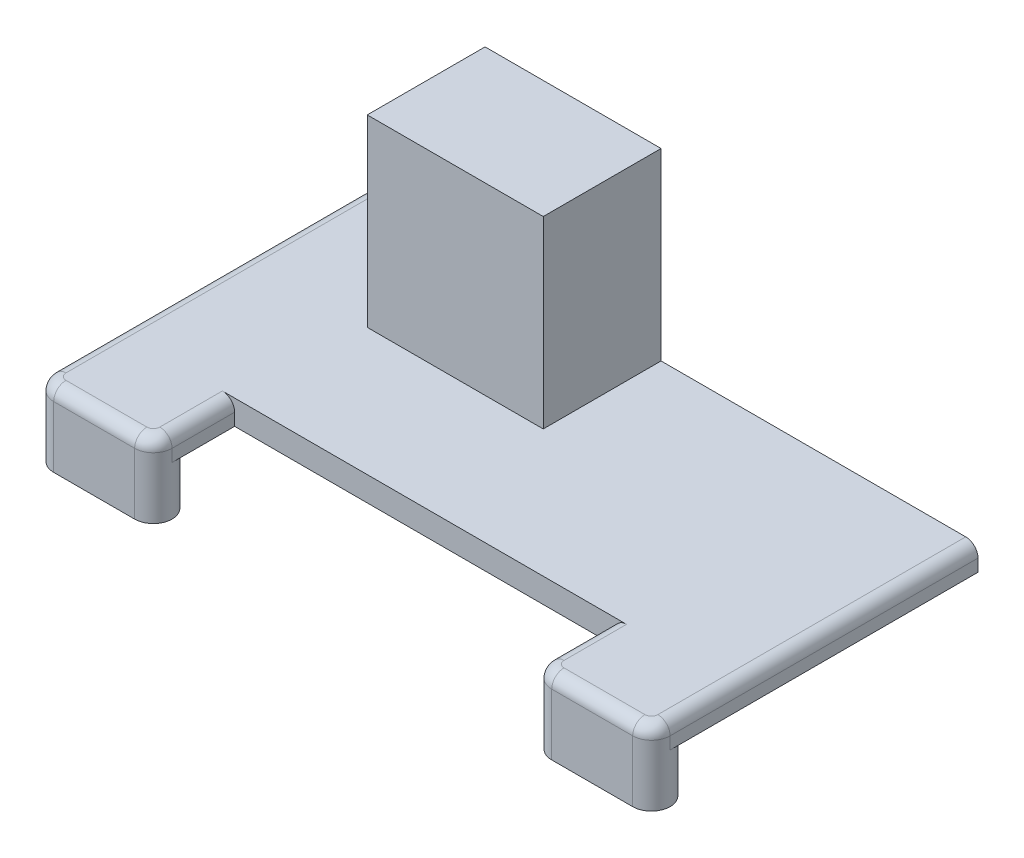
ISO-10303-21;
HEADER;
FILE_DESCRIPTION(('STEP AP214'),'2;1');
FILE_NAME('part.step','',(''),(''),'','','');
FILE_SCHEMA(('AUTOMOTIVE_DESIGN { 1 0 10303 214 1 1 1 1 }'));
ENDSEC;
DATA;
#1=APPLICATION_CONTEXT('core data for automotive mechanical design processes');
#2=APPLICATION_PROTOCOL_DEFINITION('international standard','automotive_design',2000,#1);
#3=PRODUCT_CONTEXT('',#1,'mechanical');
#4=PRODUCT('Part','Part','',(#3));
#5=PRODUCT_RELATED_PRODUCT_CATEGORY('part','',(#4));
#6=PRODUCT_DEFINITION_FORMATION('','',#4);
#7=PRODUCT_DEFINITION_CONTEXT('part definition',#1,'design');
#8=PRODUCT_DEFINITION('design','',#6,#7);
#9=PRODUCT_DEFINITION_SHAPE('','',#8);
#10=(LENGTH_UNIT() NAMED_UNIT(*) SI_UNIT(.MILLI.,.METRE.));
#11=(NAMED_UNIT(*) PLANE_ANGLE_UNIT() SI_UNIT($,.RADIAN.));
#12=(NAMED_UNIT(*) SI_UNIT($,.STERADIAN.) SOLID_ANGLE_UNIT());
#13=UNCERTAINTY_MEASURE_WITH_UNIT(LENGTH_MEASURE(1.E-05),#10,'distance_accuracy_value','');
#14=(GEOMETRIC_REPRESENTATION_CONTEXT(3) GLOBAL_UNCERTAINTY_ASSIGNED_CONTEXT((#13)) GLOBAL_UNIT_ASSIGNED_CONTEXT((#10,
#11,#12)) REPRESENTATION_CONTEXT('',''));
#15=CARTESIAN_POINT('',(0.,0.,0.));
#16=DIRECTION('',(0.,0.,1.));
#17=DIRECTION('',(1.,0.,0.));
#18=AXIS2_PLACEMENT_3D('',#15,#16,#17);
#19=CARTESIAN_POINT('',(0.,6.,0.));
#20=DIRECTION('',(0.,1.,0.));
#21=DIRECTION('',(0.,0.,1.));
#22=AXIS2_PLACEMENT_3D('',#19,#20,#21);
#23=PLANE('',#22);
#24=DIRECTION('',(1.,0.,0.));
#25=VECTOR('',#24,1.);
#26=CARTESIAN_POINT('',(-15.0591382947298,6.,-24.512734040284));
#27=LINE('',#26,#25);
#28=CARTESIAN_POINT('',(-15.0591382947298,6.,-24.512734040284));
#29=VERTEX_POINT('',#28);
#30=CARTESIAN_POINT('',(-0.711455352506912,6.,-24.512734040284));
#31=VERTEX_POINT('',#30);
#32=EDGE_CURVE('E577',#29,#31,#27,.T.);
#33=ORIENTED_EDGE('',*,*,#32,.F.);
#34=DIRECTION('',(0.,0.,1.));
#35=VECTOR('',#34,1.);
#36=CARTESIAN_POINT('',(-15.0591382947298,6.,-34.1172784368942));
#37=LINE('',#36,#35);
#38=CARTESIAN_POINT('',(-15.0591382947298,6.,-34.1172784368942));
#39=VERTEX_POINT('',#38);
#40=EDGE_CURVE('E248',#39,#29,#37,.T.);
#41=ORIENTED_EDGE('',*,*,#40,.F.);
#42=DIRECTION('',(1.,0.,0.));
#43=VECTOR('',#42,1.);
#44=CARTESIAN_POINT('',(0.,6.,-34.1172784368942));
#45=LINE('',#44,#43);
#46=CARTESIAN_POINT('',(-24.125,6.,-34.1172784368942));
#47=VERTEX_POINT('',#46);
#48=EDGE_CURVE('E302',#47,#39,#45,.T.);
#49=ORIENTED_EDGE('',*,*,#48,.F.);
#50=DIRECTION('',(0.,0.,-1.));
#51=VECTOR('',#50,1.);
#52=CARTESIAN_POINT('',(-24.125,6.,0.));
#53=LINE('',#52,#51);
#54=CARTESIAN_POINT('',(-24.125,6.,-9.01727843689422));
#55=VERTEX_POINT('',#54);
#56=EDGE_CURVE('E438',#47,#55,#53,.F.);
#57=ORIENTED_EDGE('',*,*,#56,.T.);
#58=CARTESIAN_POINT('',(-23.6,6.,-9.01727843689422));
#59=DIRECTION('',(0.,1.,0.));
#60=DIRECTION('',(0.,0.,1.));
#61=AXIS2_PLACEMENT_3D('',#58,#59,#60);
#62=CIRCLE('',#61,0.525);
#63=CARTESIAN_POINT('',(-23.6,6.,-8.49227843689422));
#64=VERTEX_POINT('',#63);
#65=EDGE_CURVE('E435',#55,#64,#62,.T.);
#66=ORIENTED_EDGE('',*,*,#65,.T.);
#67=DIRECTION('',(1.,0.,0.));
#68=VECTOR('',#67,1.);
#69=CARTESIAN_POINT('',(-17.,6.,-8.49227843689422));
#70=LINE('',#69,#68);
#71=CARTESIAN_POINT('',(-17.,6.,-8.49227843689422));
#72=VERTEX_POINT('',#71);
#73=EDGE_CURVE('E425',#64,#72,#70,.T.);
#74=ORIENTED_EDGE('',*,*,#73,.T.);
#75=CARTESIAN_POINT('',(-17.,6.,-9.01727843689422));
#76=DIRECTION('',(0.,1.,0.));
#77=DIRECTION('',(0.,0.,1.));
#78=AXIS2_PLACEMENT_3D('',#75,#76,#77);
#79=CIRCLE('',#78,0.525000000000001);
#80=CARTESIAN_POINT('',(-16.475,6.,-9.01727843689422));
#81=VERTEX_POINT('',#80);
#82=EDGE_CURVE('E428',#72,#81,#79,.T.);
#83=ORIENTED_EDGE('',*,*,#82,.T.);
#84=DIRECTION('',(0.,0.,-1.));
#85=VECTOR('',#84,1.);
#86=CARTESIAN_POINT('',(-16.475,6.,-14.1172784368942));
#87=LINE('',#86,#85);
#88=CARTESIAN_POINT('',(-16.475,6.,-14.1172784368942));
#89=VERTEX_POINT('',#88);
#90=EDGE_CURVE('E431',#81,#89,#87,.T.);
#91=ORIENTED_EDGE('',*,*,#90,.T.);
#92=DIRECTION('',(1.,0.,0.));
#93=VECTOR('',#92,1.);
#94=CARTESIAN_POINT('',(0.,6.,-14.1172784368942));
#95=LINE('',#94,#93);
#96=CARTESIAN_POINT('',(16.475,6.,-14.1172784368942));
#97=VERTEX_POINT('',#96);
#98=EDGE_CURVE('E297',#89,#97,#95,.T.);
#99=ORIENTED_EDGE('',*,*,#98,.T.);
#100=DIRECTION('',(0.,0.,-1.));
#101=VECTOR('',#100,1.);
#102=CARTESIAN_POINT('',(16.475,6.,0.));
#103=LINE('',#102,#101);
#104=CARTESIAN_POINT('',(16.475,6.,-9.01727843689422));
#105=VERTEX_POINT('',#104);
#106=EDGE_CURVE('E422',#97,#105,#103,.F.);
#107=ORIENTED_EDGE('',*,*,#106,.T.);
#108=CARTESIAN_POINT('',(17.,6.,-9.01727843689422));
#109=DIRECTION('',(0.,1.,0.));
#110=DIRECTION('',(0.,0.,1.));
#111=AXIS2_PLACEMENT_3D('',#108,#109,#110);
#112=CIRCLE('',#111,0.525000000000001);
#113=CARTESIAN_POINT('',(17.,6.,-8.49227843689422));
#114=VERTEX_POINT('',#113);
#115=EDGE_CURVE('E419',#105,#114,#112,.T.);
#116=ORIENTED_EDGE('',*,*,#115,.T.);
#117=DIRECTION('',(1.,0.,0.));
#118=VECTOR('',#117,1.);
#119=CARTESIAN_POINT('',(23.6,6.,-8.49227843689422));
#120=LINE('',#119,#118);
#121=CARTESIAN_POINT('',(23.6,6.,-8.49227843689422));
#122=VERTEX_POINT('',#121);
#123=EDGE_CURVE('E409',#114,#122,#120,.T.);
#124=ORIENTED_EDGE('',*,*,#123,.T.);
#125=CARTESIAN_POINT('',(23.6,6.,-9.01727843689422));
#126=DIRECTION('',(0.,1.,0.));
#127=DIRECTION('',(0.,0.,1.));
#128=AXIS2_PLACEMENT_3D('',#125,#126,#127);
#129=CIRCLE('',#128,0.525);
#130=CARTESIAN_POINT('',(24.125,6.,-9.01727843689422));
#131=VERTEX_POINT('',#130);
#132=EDGE_CURVE('E412',#122,#131,#129,.T.);
#133=ORIENTED_EDGE('',*,*,#132,.T.);
#134=DIRECTION('',(0.,0.,-1.));
#135=VECTOR('',#134,1.);
#136=CARTESIAN_POINT('',(24.125,6.,-34.1172784368942));
#137=LINE('',#136,#135);
#138=CARTESIAN_POINT('',(24.125,6.,-34.1172784368942));
#139=VERTEX_POINT('',#138);
#140=EDGE_CURVE('E415',#131,#139,#137,.T.);
#141=ORIENTED_EDGE('',*,*,#140,.T.);
#142=CARTESIAN_POINT('',(-0.711455352506912,6.,-34.1172784368942));
#143=VERTEX_POINT('',#142);
#144=EDGE_CURVE('E300',#143,#139,#45,.T.);
#145=ORIENTED_EDGE('',*,*,#144,.F.);
#146=DIRECTION('',(0.,0.,-1.));
#147=VECTOR('',#146,1.);
#148=CARTESIAN_POINT('',(-0.711455352506912,6.,-34.1172784368942));
#149=LINE('',#148,#147);
#150=EDGE_CURVE('E244',#31,#143,#149,.T.);
#151=ORIENTED_EDGE('',*,*,#150,.F.);
#152=EDGE_LOOP('',(#33,#41,#49,#57,#66,#74,#83,#91,#99,#107,#116,#124,#133,#141,#145,#151));
#153=FACE_BOUND('',#152,.T.);
#154=ADVANCED_FACE('F47',(#153),#23,.T.);
#155=CARTESIAN_POINT('',(0.,4.,0.));
#156=DIRECTION('',(0.,1.,0.));
#157=DIRECTION('',(0.,0.,1.));
#158=AXIS2_PLACEMENT_3D('',#155,#156,#157);
#159=PLANE('',#158);
#160=CARTESIAN_POINT('',(-23.6,4.,-9.01727843689422));
#161=DIRECTION('',(0.,1.,0.));
#162=DIRECTION('',(0.,0.,1.));
#163=AXIS2_PLACEMENT_3D('',#160,#161,#162);
#164=CIRCLE('',#163,1.525);
#165=CARTESIAN_POINT('',(-23.6,4.,-10.5422784368942));
#166=VERTEX_POINT('',#165);
#167=CARTESIAN_POINT('',(-25.125,4.,-9.01727843689422));
#168=VERTEX_POINT('',#167);
#169=EDGE_CURVE('E275',#166,#168,#164,.T.);
#170=ORIENTED_EDGE('',*,*,#169,.T.);
#171=DIRECTION('',(0.,0.,-1.));
#172=VECTOR('',#171,1.);
#173=CARTESIAN_POINT('',(-25.125,4.,0.));
#174=LINE('',#173,#172);
#175=CARTESIAN_POINT('',(-25.125,4.,-34.1172784368942));
#176=VERTEX_POINT('',#175);
#177=EDGE_CURVE('E286',#168,#176,#174,.T.);
#178=ORIENTED_EDGE('',*,*,#177,.T.);
#179=DIRECTION('',(1.,0.,0.));
#180=VECTOR('',#179,1.);
#181=CARTESIAN_POINT('',(0.,4.,-34.1172784368942));
#182=LINE('',#181,#180);
#183=CARTESIAN_POINT('',(25.125,4.,-34.1172784368942));
#184=VERTEX_POINT('',#183);
#185=EDGE_CURVE('E301',#176,#184,#182,.T.);
#186=ORIENTED_EDGE('',*,*,#185,.T.);
#187=DIRECTION('',(0.,0.,-1.));
#188=VECTOR('',#187,1.);
#189=CARTESIAN_POINT('',(25.125,4.,0.));
#190=LINE('',#189,#188);
#191=CARTESIAN_POINT('',(25.125,4.,-9.01727843689422));
#192=VERTEX_POINT('',#191);
#193=EDGE_CURVE('E322',#192,#184,#190,.T.);
#194=ORIENTED_EDGE('',*,*,#193,.F.);
#195=CARTESIAN_POINT('',(23.6,4.,-9.01727843689422));
#196=DIRECTION('',(0.,1.,0.));
#197=DIRECTION('',(0.,0.,-1.));
#198=AXIS2_PLACEMENT_3D('',#195,#196,#197);
#199=CIRCLE('',#198,1.525);
#200=CARTESIAN_POINT('',(23.6,4.,-10.5422784368942));
#201=VERTEX_POINT('',#200);
#202=EDGE_CURVE('E359',#192,#201,#199,.T.);
#203=ORIENTED_EDGE('',*,*,#202,.T.);
#204=DIRECTION('',(-1.,0.,0.));
#205=VECTOR('',#204,1.);
#206=CARTESIAN_POINT('',(23.6,4.,-10.5422784368942));
#207=LINE('',#206,#205);
#208=CARTESIAN_POINT('',(17.,4.,-10.5422784368942));
#209=VERTEX_POINT('',#208);
#210=EDGE_CURVE('E363',#201,#209,#207,.T.);
#211=ORIENTED_EDGE('',*,*,#210,.T.);
#212=CARTESIAN_POINT('',(17.,4.,-9.01727843689422));
#213=DIRECTION('',(0.,1.,0.));
#214=DIRECTION('',(0.,0.,-1.));
#215=AXIS2_PLACEMENT_3D('',#212,#213,#214);
#216=CIRCLE('',#215,1.525);
#217=CARTESIAN_POINT('',(15.475,4.,-9.01727843689422));
#218=VERTEX_POINT('',#217);
#219=EDGE_CURVE('E368',#209,#218,#216,.T.);
#220=ORIENTED_EDGE('',*,*,#219,.T.);
#221=DIRECTION('',(0.,0.,-1.));
#222=VECTOR('',#221,1.);
#223=CARTESIAN_POINT('',(15.475,4.,0.));
#224=LINE('',#223,#222);
#225=CARTESIAN_POINT('',(15.475,4.,-14.1172784368942));
#226=VERTEX_POINT('',#225);
#227=EDGE_CURVE('E318',#218,#226,#224,.T.);
#228=ORIENTED_EDGE('',*,*,#227,.T.);
#229=DIRECTION('',(1.,0.,0.));
#230=VECTOR('',#229,1.);
#231=CARTESIAN_POINT('',(0.,4.,-14.1172784368942));
#232=LINE('',#231,#230);
#233=CARTESIAN_POINT('',(-15.475,4.,-14.1172784368942));
#234=VERTEX_POINT('',#233);
#235=EDGE_CURVE('E314',#234,#226,#232,.T.);
#236=ORIENTED_EDGE('',*,*,#235,.F.);
#237=DIRECTION('',(0.,0.,-1.));
#238=VECTOR('',#237,1.);
#239=CARTESIAN_POINT('',(-15.475,4.,0.));
#240=LINE('',#239,#238);
#241=CARTESIAN_POINT('',(-15.475,4.,-9.01727843689422));
#242=VERTEX_POINT('',#241);
#243=EDGE_CURVE('E310',#242,#234,#240,.T.);
#244=ORIENTED_EDGE('',*,*,#243,.F.);
#245=CARTESIAN_POINT('',(-17.,4.,-9.01727843689422));
#246=DIRECTION('',(0.,1.,0.));
#247=DIRECTION('',(0.,0.,1.));
#248=AXIS2_PLACEMENT_3D('',#245,#246,#247);
#249=CIRCLE('',#248,1.525);
#250=CARTESIAN_POINT('',(-17.,4.,-10.5422784368942));
#251=VERTEX_POINT('',#250);
#252=EDGE_CURVE('E290',#242,#251,#249,.T.);
#253=ORIENTED_EDGE('',*,*,#252,.T.);
#254=DIRECTION('',(-1.,0.,0.));
#255=VECTOR('',#254,1.);
#256=CARTESIAN_POINT('',(-23.6,4.,-10.5422784368942));
#257=LINE('',#256,#255);
#258=EDGE_CURVE('E270',#251,#166,#257,.T.);
#259=ORIENTED_EDGE('',*,*,#258,.T.);
#260=EDGE_LOOP('',(#170,#178,#186,#194,#203,#211,#220,#228,#236,#244,#253,#259));
#261=FACE_BOUND('',#260,.T.);
#262=ADVANCED_FACE('F526',(#261),#159,.F.);
#263=CARTESIAN_POINT('',(23.6,4.,-9.01727843689422));
#264=DIRECTION('',(0.,-1.,0.));
#265=DIRECTION('',(0.,0.,-1.));
#266=AXIS2_PLACEMENT_3D('',#263,#264,#265);
#267=CYLINDRICAL_SURFACE('',#266,1.525);
#268=DIRECTION('',(0.,-1.,0.));
#269=VECTOR('',#268,1.);
#270=CARTESIAN_POINT('',(25.125,6.,-9.01727843689422));
#271=LINE('',#270,#269);
#272=CARTESIAN_POINT('',(25.125,5.,-9.01727843689422));
#273=VERTEX_POINT('',#272);
#274=EDGE_CURVE('E334',#273,#192,#271,.T.);
#275=ORIENTED_EDGE('',*,*,#274,.F.);
#276=CARTESIAN_POINT('',(23.6,5.,-9.01727843689422));
#277=DIRECTION('',(0.,1.,0.));
#278=DIRECTION('',(0.,0.,1.));
#279=AXIS2_PLACEMENT_3D('',#276,#277,#278);
#280=CIRCLE('',#279,1.525);
#281=CARTESIAN_POINT('',(23.6,5.,-7.49227843689422));
#282=VERTEX_POINT('',#281);
#283=EDGE_CURVE('E73',#273,#282,#280,.F.);
#284=ORIENTED_EDGE('',*,*,#283,.T.);
#285=DIRECTION('',(0.,-1.,0.));
#286=VECTOR('',#285,1.);
#287=CARTESIAN_POINT('',(23.6,4.,-7.49227843689422));
#288=LINE('',#287,#286);
#289=CARTESIAN_POINT('',(23.6,0.,-7.49227843689422));
#290=VERTEX_POINT('',#289);
#291=EDGE_CURVE('E372',#282,#290,#288,.T.);
#292=ORIENTED_EDGE('',*,*,#291,.T.);
#293=CARTESIAN_POINT('',(23.6,0.,-9.01727843689422));
#294=DIRECTION('',(0.,1.,0.));
#295=DIRECTION('',(0.,0.,-1.));
#296=AXIS2_PLACEMENT_3D('',#293,#294,#295);
#297=CIRCLE('',#296,1.525);
#298=CARTESIAN_POINT('',(23.6,0.,-10.5422784368942));
#299=VERTEX_POINT('',#298);
#300=EDGE_CURVE('E358',#290,#299,#297,.T.);
#301=ORIENTED_EDGE('',*,*,#300,.T.);
#302=DIRECTION('',(0.,-1.,0.));
#303=VECTOR('',#302,1.);
#304=CARTESIAN_POINT('',(23.6,4.,-10.5422784368942));
#305=LINE('',#304,#303);
#306=EDGE_CURVE('E395',#201,#299,#305,.T.);
#307=ORIENTED_EDGE('',*,*,#306,.F.);
#308=ORIENTED_EDGE('',*,*,#202,.F.);
#309=EDGE_LOOP('',(#275,#284,#292,#301,#307,#308));
#310=FACE_BOUND('',#309,.T.);
#311=ADVANCED_FACE('F536',(#310),#267,.T.);
#312=CARTESIAN_POINT('',(23.6,4.,-10.5422784368942));
#313=DIRECTION('',(0.,0.,1.));
#314=DIRECTION('',(1.,0.,0.));
#315=AXIS2_PLACEMENT_3D('',#312,#313,#314);
#316=PLANE('',#315);
#317=DIRECTION('',(-1.,0.,0.));
#318=VECTOR('',#317,1.);
#319=CARTESIAN_POINT('',(23.6,0.,-10.5422784368942));
#320=LINE('',#319,#318);
#321=CARTESIAN_POINT('',(17.,0.,-10.5422784368942));
#322=VERTEX_POINT('',#321);
#323=EDGE_CURVE('E376',#299,#322,#320,.T.);
#324=ORIENTED_EDGE('',*,*,#323,.T.);
#325=DIRECTION('',(0.,-1.,0.));
#326=VECTOR('',#325,1.);
#327=CARTESIAN_POINT('',(17.,4.,-10.5422784368942));
#328=LINE('',#327,#326);
#329=EDGE_CURVE('E391',#209,#322,#328,.T.);
#330=ORIENTED_EDGE('',*,*,#329,.F.);
#331=ORIENTED_EDGE('',*,*,#210,.F.);
#332=ORIENTED_EDGE('',*,*,#306,.T.);
#333=EDGE_LOOP('',(#324,#330,#331,#332));
#334=FACE_BOUND('',#333,.T.);
#335=ADVANCED_FACE('F637',(#334),#316,.F.);
#336=CARTESIAN_POINT('',(17.,4.,-9.01727843689422));
#337=DIRECTION('',(0.,-1.,0.));
#338=DIRECTION('',(0.,0.,-1.));
#339=AXIS2_PLACEMENT_3D('',#336,#337,#338);
#340=CYLINDRICAL_SURFACE('',#339,1.525);
#341=DIRECTION('',(0.,-1.,0.));
#342=VECTOR('',#341,1.);
#343=CARTESIAN_POINT('',(17.,4.,-7.49227843689422));
#344=LINE('',#343,#342);
#345=CARTESIAN_POINT('',(17.,5.,-7.49227843689422));
#346=VERTEX_POINT('',#345);
#347=CARTESIAN_POINT('',(17.,0.,-7.49227843689422));
#348=VERTEX_POINT('',#347);
#349=EDGE_CURVE('E388',#346,#348,#344,.T.);
#350=ORIENTED_EDGE('',*,*,#349,.F.);
#351=CARTESIAN_POINT('',(17.,5.,-9.01727843689422));
#352=DIRECTION('',(0.,1.,0.));
#353=DIRECTION('',(0.,0.,1.));
#354=AXIS2_PLACEMENT_3D('',#351,#352,#353);
#355=CIRCLE('',#354,1.525);
#356=CARTESIAN_POINT('',(15.475,5.,-9.01727843689422));
#357=VERTEX_POINT('',#356);
#358=EDGE_CURVE('E454',#346,#357,#355,.F.);
#359=ORIENTED_EDGE('',*,*,#358,.T.);
#360=DIRECTION('',(0.,-1.,0.));
#361=VECTOR('',#360,1.);
#362=CARTESIAN_POINT('',(15.475,6.,-9.01727843689422));
#363=LINE('',#362,#361);
#364=EDGE_CURVE('E337',#357,#218,#363,.T.);
#365=ORIENTED_EDGE('',*,*,#364,.T.);
#366=ORIENTED_EDGE('',*,*,#219,.F.);
#367=ORIENTED_EDGE('',*,*,#329,.T.);
#368=CARTESIAN_POINT('',(17.,0.,-9.01727843689422));
#369=DIRECTION('',(0.,1.,0.));
#370=DIRECTION('',(0.,0.,-1.));
#371=AXIS2_PLACEMENT_3D('',#368,#369,#370);
#372=CIRCLE('',#371,1.525);
#373=EDGE_CURVE('E379',#322,#348,#372,.T.);
#374=ORIENTED_EDGE('',*,*,#373,.T.);
#375=EDGE_LOOP('',(#350,#359,#365,#366,#367,#374));
#376=FACE_BOUND('',#375,.T.);
#377=ADVANCED_FACE('F518',(#376),#340,.T.);
#378=CARTESIAN_POINT('',(23.6,4.,-7.49227843689422));
#379=DIRECTION('',(0.,0.,-1.));
#380=DIRECTION('',(-1.,0.,0.));
#381=AXIS2_PLACEMENT_3D('',#378,#379,#380);
#382=PLANE('',#381);
#383=ORIENTED_EDGE('',*,*,#291,.F.);
#384=DIRECTION('',(1.,0.,0.));
#385=VECTOR('',#384,1.);
#386=CARTESIAN_POINT('',(17.,5.,-7.49227843689422));
#387=LINE('',#386,#385);
#388=EDGE_CURVE('E465',#282,#346,#387,.F.);
#389=ORIENTED_EDGE('',*,*,#388,.T.);
#390=ORIENTED_EDGE('',*,*,#349,.T.);
#391=DIRECTION('',(1.,0.,0.));
#392=VECTOR('',#391,1.);
#393=CARTESIAN_POINT('',(23.6,0.,-7.49227843689422));
#394=LINE('',#393,#392);
#395=EDGE_CURVE('E364',#348,#290,#394,.T.);
#396=ORIENTED_EDGE('',*,*,#395,.T.);
#397=EDGE_LOOP('',(#383,#389,#390,#396));
#398=FACE_BOUND('',#397,.T.);
#399=ADVANCED_FACE('F535',(#398),#382,.F.);
#400=CARTESIAN_POINT('',(23.6,0.,-9.01727843689422));
#401=DIRECTION('',(0.,-1.,0.));
#402=DIRECTION('',(0.,0.,-1.));
#403=AXIS2_PLACEMENT_3D('',#400,#401,#402);
#404=PLANE('',#403);
#405=ORIENTED_EDGE('',*,*,#300,.F.);
#406=ORIENTED_EDGE('',*,*,#395,.F.);
#407=ORIENTED_EDGE('',*,*,#373,.F.);
#408=ORIENTED_EDGE('',*,*,#323,.F.);
#409=EDGE_LOOP('',(#405,#406,#407,#408));
#410=FACE_BOUND('',#409,.T.);
#411=ADVANCED_FACE('F533',(#410),#404,.T.);
#412=CARTESIAN_POINT('',(-25.125,6.,0.));
#413=DIRECTION('',(-1.,0.,0.));
#414=DIRECTION('',(0.,0.,1.));
#415=AXIS2_PLACEMENT_3D('',#412,#413,#414);
#416=PLANE('',#415);
#417=DIRECTION('',(0.,-1.,0.));
#418=VECTOR('',#417,1.);
#419=CARTESIAN_POINT('',(-25.125,6.,-9.01727843689422));
#420=LINE('',#419,#418);
#421=CARTESIAN_POINT('',(-25.125,5.,-9.01727843689422));
#422=VERTEX_POINT('',#421);
#423=EDGE_CURVE('E355',#422,#168,#420,.T.);
#424=ORIENTED_EDGE('',*,*,#423,.F.);
#425=DIRECTION('',(0.,0.,-1.));
#426=VECTOR('',#425,1.);
#427=CARTESIAN_POINT('',(-25.125,5.,0.));
#428=LINE('',#427,#426);
#429=CARTESIAN_POINT('',(-25.125,5.,-34.1172784368942));
#430=VERTEX_POINT('',#429);
#431=EDGE_CURVE('E399',#422,#430,#428,.T.);
#432=ORIENTED_EDGE('',*,*,#431,.T.);
#433=DIRECTION('',(0.,-1.,0.));
#434=VECTOR('',#433,1.);
#435=CARTESIAN_POINT('',(-25.125,6.,-34.1172784368942));
#436=LINE('',#435,#434);
#437=EDGE_CURVE('E306',#430,#176,#436,.T.);
#438=ORIENTED_EDGE('',*,*,#437,.T.);
#439=ORIENTED_EDGE('',*,*,#177,.F.);
#440=EDGE_LOOP('',(#424,#432,#438,#439));
#441=FACE_BOUND('',#440,.T.);
#442=ADVANCED_FACE('F551',(#441),#416,.T.);
#443=CARTESIAN_POINT('',(-23.6,6.,-9.01727843689422));
#444=DIRECTION('',(0.,-1.,0.));
#445=DIRECTION('',(0.,0.,-1.));
#446=AXIS2_PLACEMENT_3D('',#443,#444,#445);
#447=CYLINDRICAL_SURFACE('',#446,1.525);
#448=DIRECTION('',(0.,-1.,0.));
#449=VECTOR('',#448,1.);
#450=CARTESIAN_POINT('',(-23.6,6.,-7.49227843689422));
#451=LINE('',#450,#449);
#452=CARTESIAN_POINT('',(-23.6,5.,-7.49227843689422));
#453=VERTEX_POINT('',#452);
#454=CARTESIAN_POINT('',(-23.6,0.,-7.49227843689422));
#455=VERTEX_POINT('',#454);
#456=EDGE_CURVE('E352',#453,#455,#451,.T.);
#457=ORIENTED_EDGE('',*,*,#456,.F.);
#458=CARTESIAN_POINT('',(-23.6,5.,-9.01727843689422));
#459=DIRECTION('',(0.,1.,0.));
#460=DIRECTION('',(0.,0.,1.));
#461=AXIS2_PLACEMENT_3D('',#458,#459,#460);
#462=CIRCLE('',#461,1.525);
#463=EDGE_CURVE('E441',#453,#422,#462,.F.);
#464=ORIENTED_EDGE('',*,*,#463,.T.);
#465=ORIENTED_EDGE('',*,*,#423,.T.);
#466=ORIENTED_EDGE('',*,*,#169,.F.);
#467=DIRECTION('',(0.,-1.,0.));
#468=VECTOR('',#467,1.);
#469=CARTESIAN_POINT('',(-23.6,4.,-10.5422784368942));
#470=LINE('',#469,#468);
#471=CARTESIAN_POINT('',(-23.6,0.,-10.5422784368942));
#472=VERTEX_POINT('',#471);
#473=EDGE_CURVE('E265',#166,#472,#470,.T.);
#474=ORIENTED_EDGE('',*,*,#473,.T.);
#475=CARTESIAN_POINT('',(-23.6,0.,-9.01727843689422));
#476=DIRECTION('',(0.,1.,0.));
#477=DIRECTION('',(0.,0.,1.));
#478=AXIS2_PLACEMENT_3D('',#475,#476,#477);
#479=CIRCLE('',#478,1.525);
#480=EDGE_CURVE('E282',#472,#455,#479,.T.);
#481=ORIENTED_EDGE('',*,*,#480,.T.);
#482=EDGE_LOOP('',(#457,#464,#465,#466,#474,#481));
#483=FACE_BOUND('',#482,.T.);
#484=ADVANCED_FACE('F557',(#483),#447,.T.);
#485=CARTESIAN_POINT('',(0.,6.,-7.49227843689422));
#486=DIRECTION('',(0.,0.,-1.));
#487=DIRECTION('',(-1.,0.,0.));
#488=AXIS2_PLACEMENT_3D('',#485,#486,#487);
#489=PLANE('',#488);
#490=DIRECTION('',(0.,-1.,0.));
#491=VECTOR('',#490,1.);
#492=CARTESIAN_POINT('',(-17.,6.,-7.49227843689422));
#493=LINE('',#492,#491);
#494=CARTESIAN_POINT('',(-17.,5.,-7.49227843689422));
#495=VERTEX_POINT('',#494);
#496=CARTESIAN_POINT('',(-17.,0.,-7.49227843689422));
#497=VERTEX_POINT('',#496);
#498=EDGE_CURVE('E349',#495,#497,#493,.T.);
#499=ORIENTED_EDGE('',*,*,#498,.F.);
#500=DIRECTION('',(1.,0.,0.));
#501=VECTOR('',#500,1.);
#502=CARTESIAN_POINT('',(-23.6,5.,-7.49227843689422));
#503=LINE('',#502,#501);
#504=EDGE_CURVE('E462',#495,#453,#503,.F.);
#505=ORIENTED_EDGE('',*,*,#504,.T.);
#506=ORIENTED_EDGE('',*,*,#456,.T.);
#507=DIRECTION('',(1.,0.,0.));
#508=VECTOR('',#507,1.);
#509=CARTESIAN_POINT('',(-23.6,0.,-7.49227843689422));
#510=LINE('',#509,#508);
#511=EDGE_CURVE('E278',#455,#497,#510,.T.);
#512=ORIENTED_EDGE('',*,*,#511,.T.);
#513=EDGE_LOOP('',(#499,#505,#506,#512));
#514=FACE_BOUND('',#513,.T.);
#515=ADVANCED_FACE('F622',(#514),#489,.F.);
#516=CARTESIAN_POINT('',(-17.,6.,-9.01727843689422));
#517=DIRECTION('',(0.,-1.,0.));
#518=DIRECTION('',(0.,0.,-1.));
#519=AXIS2_PLACEMENT_3D('',#516,#517,#518);
#520=CYLINDRICAL_SURFACE('',#519,1.525);
#521=DIRECTION('',(0.,-1.,0.));
#522=VECTOR('',#521,1.);
#523=CARTESIAN_POINT('',(-15.475,6.,-9.01727843689422));
#524=LINE('',#523,#522);
#525=CARTESIAN_POINT('',(-15.475,5.,-9.01727843689422));
#526=VERTEX_POINT('',#525);
#527=EDGE_CURVE('E346',#526,#242,#524,.T.);
#528=ORIENTED_EDGE('',*,*,#527,.F.);
#529=CARTESIAN_POINT('',(-17.,5.,-9.01727843689422));
#530=DIRECTION('',(0.,1.,0.));
#531=DIRECTION('',(0.,0.,1.));
#532=AXIS2_PLACEMENT_3D('',#529,#530,#531);
#533=CIRCLE('',#532,1.525);
#534=EDGE_CURVE('E447',#526,#495,#533,.F.);
#535=ORIENTED_EDGE('',*,*,#534,.T.);
#536=ORIENTED_EDGE('',*,*,#498,.T.);
#537=CARTESIAN_POINT('',(-17.,0.,-9.01727843689422));
#538=DIRECTION('',(0.,1.,0.));
#539=DIRECTION('',(0.,0.,1.));
#540=AXIS2_PLACEMENT_3D('',#537,#538,#539);
#541=CIRCLE('',#540,1.525);
#542=CARTESIAN_POINT('',(-17.,0.,-10.5422784368942));
#543=VERTEX_POINT('',#542);
#544=EDGE_CURVE('E274',#497,#543,#541,.T.);
#545=ORIENTED_EDGE('',*,*,#544,.T.);
#546=DIRECTION('',(0.,-1.,0.));
#547=VECTOR('',#546,1.);
#548=CARTESIAN_POINT('',(-17.,4.,-10.5422784368942));
#549=LINE('',#548,#547);
#550=EDGE_CURVE('E261',#251,#543,#549,.T.);
#551=ORIENTED_EDGE('',*,*,#550,.F.);
#552=ORIENTED_EDGE('',*,*,#252,.F.);
#553=EDGE_LOOP('',(#528,#535,#536,#545,#551,#552));
#554=FACE_BOUND('',#553,.T.);
#555=ADVANCED_FACE('F618',(#554),#520,.T.);
#556=CARTESIAN_POINT('',(-15.475,6.,0.));
#557=DIRECTION('',(-1.,0.,0.));
#558=DIRECTION('',(0.,0.,1.));
#559=AXIS2_PLACEMENT_3D('',#556,#557,#558);
#560=PLANE('',#559);
#561=DIRECTION('',(0.,-1.,0.));
#562=VECTOR('',#561,1.);
#563=CARTESIAN_POINT('',(-15.475,6.,-14.1172784368942));
#564=LINE('',#563,#562);
#565=CARTESIAN_POINT('',(-15.475,5.,-14.1172784368942));
#566=VERTEX_POINT('',#565);
#567=EDGE_CURVE('E343',#566,#234,#564,.T.);
#568=ORIENTED_EDGE('',*,*,#567,.F.);
#569=DIRECTION('',(0.,0.,-1.));
#570=VECTOR('',#569,1.);
#571=CARTESIAN_POINT('',(-15.475,5.,-9.01727843689422));
#572=LINE('',#571,#570);
#573=EDGE_CURVE('E444',#566,#526,#572,.F.);
#574=ORIENTED_EDGE('',*,*,#573,.T.);
#575=ORIENTED_EDGE('',*,*,#527,.T.);
#576=ORIENTED_EDGE('',*,*,#243,.T.);
#577=EDGE_LOOP('',(#568,#574,#575,#576));
#578=FACE_BOUND('',#577,.T.);
#579=ADVANCED_FACE('F614',(#578),#560,.F.);
#580=CARTESIAN_POINT('',(0.,6.,-14.1172784368942));
#581=DIRECTION('',(0.,0.,-1.));
#582=DIRECTION('',(-1.,0.,0.));
#583=AXIS2_PLACEMENT_3D('',#580,#581,#582);
#584=PLANE('',#583);
#585=ORIENTED_EDGE('',*,*,#235,.T.);
#586=DIRECTION('',(0.,-1.,0.));
#587=VECTOR('',#586,1.);
#588=CARTESIAN_POINT('',(15.475,6.,-14.1172784368942));
#589=LINE('',#588,#587);
#590=CARTESIAN_POINT('',(15.475,5.,-14.1172784368942));
#591=VERTEX_POINT('',#590);
#592=EDGE_CURVE('E340',#591,#226,#589,.T.);
#593=ORIENTED_EDGE('',*,*,#592,.F.);
#594=CARTESIAN_POINT('',(16.475,5.,-14.1172784368942));
#595=DIRECTION('',(0.,0.,-1.));
#596=DIRECTION('',(-1.,0.,0.));
#597=AXIS2_PLACEMENT_3D('',#594,#595,#596);
#598=CIRCLE('',#597,1.);
#599=EDGE_CURVE('E11',#591,#97,#598,.T.);
#600=ORIENTED_EDGE('',*,*,#599,.T.);
#601=ORIENTED_EDGE('',*,*,#98,.F.);
#602=CARTESIAN_POINT('',(-16.475,5.,-14.1172784368942));
#603=DIRECTION('',(0.,0.,-1.));
#604=DIRECTION('',(-1.,0.,0.));
#605=AXIS2_PLACEMENT_3D('',#602,#603,#604);
#606=CIRCLE('',#605,1.);
#607=EDGE_CURVE('E57',#89,#566,#606,.T.);
#608=ORIENTED_EDGE('',*,*,#607,.T.);
#609=ORIENTED_EDGE('',*,*,#567,.T.);
#610=EDGE_LOOP('',(#585,#593,#600,#601,#608,#609));
#611=FACE_BOUND('',#610,.T.);
#612=ADVANCED_FACE('F611',(#611),#584,.F.);
#613=CARTESIAN_POINT('',(15.475,6.,0.));
#614=DIRECTION('',(-1.,0.,0.));
#615=DIRECTION('',(0.,0.,1.));
#616=AXIS2_PLACEMENT_3D('',#613,#614,#615);
#617=PLANE('',#616);
#618=ORIENTED_EDGE('',*,*,#364,.F.);
#619=DIRECTION('',(0.,0.,-1.));
#620=VECTOR('',#619,1.);
#621=CARTESIAN_POINT('',(15.475,5.,0.));
#622=LINE('',#621,#620);
#623=EDGE_CURVE('E450',#357,#591,#622,.T.);
#624=ORIENTED_EDGE('',*,*,#623,.T.);
#625=ORIENTED_EDGE('',*,*,#592,.T.);
#626=ORIENTED_EDGE('',*,*,#227,.F.);
#627=EDGE_LOOP('',(#618,#624,#625,#626));
#628=FACE_BOUND('',#627,.T.);
#629=ADVANCED_FACE('F522',(#628),#617,.T.);
#630=CARTESIAN_POINT('',(25.125,6.,0.));
#631=DIRECTION('',(-1.,0.,0.));
#632=DIRECTION('',(0.,0.,1.));
#633=AXIS2_PLACEMENT_3D('',#630,#631,#632);
#634=PLANE('',#633);
#635=DIRECTION('',(0.,-1.,0.));
#636=VECTOR('',#635,1.);
#637=CARTESIAN_POINT('',(25.125,6.,-34.1172784368942));
#638=LINE('',#637,#636);
#639=CARTESIAN_POINT('',(25.125,5.,-34.1172784368942));
#640=VERTEX_POINT('',#639);
#641=EDGE_CURVE('E331',#640,#184,#638,.T.);
#642=ORIENTED_EDGE('',*,*,#641,.F.);
#643=DIRECTION('',(0.,0.,-1.));
#644=VECTOR('',#643,1.);
#645=CARTESIAN_POINT('',(25.125,5.,-9.01727843689422));
#646=LINE('',#645,#644);
#647=EDGE_CURVE('E457',#640,#273,#646,.F.);
#648=ORIENTED_EDGE('',*,*,#647,.T.);
#649=ORIENTED_EDGE('',*,*,#274,.T.);
#650=ORIENTED_EDGE('',*,*,#193,.T.);
#651=EDGE_LOOP('',(#642,#648,#649,#650));
#652=FACE_BOUND('',#651,.T.);
#653=ADVANCED_FACE('F543',(#652),#634,.F.);
#654=CARTESIAN_POINT('',(0.,6.,-34.1172784368942));
#655=DIRECTION('',(0.,0.,-1.));
#656=DIRECTION('',(-1.,0.,0.));
#657=AXIS2_PLACEMENT_3D('',#654,#655,#656);
#658=PLANE('',#657);
#659=ORIENTED_EDGE('',*,*,#437,.F.);
#660=CARTESIAN_POINT('',(-24.125,5.,-34.1172784368942));
#661=DIRECTION('',(0.,0.,-1.));
#662=DIRECTION('',(-1.,0.,0.));
#663=AXIS2_PLACEMENT_3D('',#660,#661,#662);
#664=CIRCLE('',#663,1.);
#665=EDGE_CURVE('E406',#430,#47,#664,.T.);
#666=ORIENTED_EDGE('',*,*,#665,.T.);
#667=ORIENTED_EDGE('',*,*,#48,.T.);
#668=DIRECTION('',(0.,-1.,0.));
#669=VECTOR('',#668,1.);
#670=CARTESIAN_POINT('',(-15.0591382947298,21.,-34.1172784368942));
#671=LINE('',#670,#669);
#672=CARTESIAN_POINT('',(-15.0591382947298,21.,-34.1172784368942));
#673=VERTEX_POINT('',#672);
#674=EDGE_CURVE('E568',#673,#39,#671,.T.);
#675=ORIENTED_EDGE('',*,*,#674,.F.);
#676=DIRECTION('',(-1.,0.,0.));
#677=VECTOR('',#676,1.);
#678=CARTESIAN_POINT('',(-15.0591382947298,21.,-34.1172784368942));
#679=LINE('',#678,#677);
#680=CARTESIAN_POINT('',(-0.711455352506912,21.,-34.1172784368942));
#681=VERTEX_POINT('',#680);
#682=EDGE_CURVE('E240',#681,#673,#679,.T.);
#683=ORIENTED_EDGE('',*,*,#682,.F.);
#684=DIRECTION('',(0.,-1.,0.));
#685=VECTOR('',#684,1.);
#686=CARTESIAN_POINT('',(-0.711455352506912,21.,-34.1172784368942));
#687=LINE('',#686,#685);
#688=EDGE_CURVE('E65',#681,#143,#687,.T.);
#689=ORIENTED_EDGE('',*,*,#688,.T.);
#690=ORIENTED_EDGE('',*,*,#144,.T.);
#691=CARTESIAN_POINT('',(24.125,5.,-34.1172784368942));
#692=DIRECTION('',(0.,0.,-1.));
#693=DIRECTION('',(-1.,0.,0.));
#694=AXIS2_PLACEMENT_3D('',#691,#692,#693);
#695=CIRCLE('',#694,1.);
#696=EDGE_CURVE('E403',#139,#640,#695,.T.);
#697=ORIENTED_EDGE('',*,*,#696,.T.);
#698=ORIENTED_EDGE('',*,*,#641,.T.);
#699=ORIENTED_EDGE('',*,*,#185,.F.);
#700=EDGE_LOOP('',(#659,#666,#667,#675,#683,#689,#690,#697,#698,#699));
#701=FACE_BOUND('',#700,.T.);
#702=ADVANCED_FACE('F545',(#701),#658,.T.);
#703=CARTESIAN_POINT('',(-23.6,4.,-10.5422784368942));
#704=DIRECTION('',(0.,0.,1.));
#705=DIRECTION('',(1.,0.,0.));
#706=AXIS2_PLACEMENT_3D('',#703,#704,#705);
#707=PLANE('',#706);
#708=DIRECTION('',(-1.,0.,0.));
#709=VECTOR('',#708,1.);
#710=CARTESIAN_POINT('',(-23.6,0.,-10.5422784368942));
#711=LINE('',#710,#709);
#712=EDGE_CURVE('E271',#543,#472,#711,.T.);
#713=ORIENTED_EDGE('',*,*,#712,.T.);
#714=ORIENTED_EDGE('',*,*,#473,.F.);
#715=ORIENTED_EDGE('',*,*,#258,.F.);
#716=ORIENTED_EDGE('',*,*,#550,.T.);
#717=EDGE_LOOP('',(#713,#714,#715,#716));
#718=FACE_BOUND('',#717,.T.);
#719=ADVANCED_FACE('F606',(#718),#707,.F.);
#720=CARTESIAN_POINT('',(-23.6,0.,-9.01727843689422));
#721=DIRECTION('',(0.,1.,0.));
#722=DIRECTION('',(0.,0.,1.));
#723=AXIS2_PLACEMENT_3D('',#720,#721,#722);
#724=PLANE('',#723);
#725=ORIENTED_EDGE('',*,*,#480,.F.);
#726=ORIENTED_EDGE('',*,*,#712,.F.);
#727=ORIENTED_EDGE('',*,*,#544,.F.);
#728=ORIENTED_EDGE('',*,*,#511,.F.);
#729=EDGE_LOOP('',(#725,#726,#727,#728));
#730=FACE_BOUND('',#729,.T.);
#731=ADVANCED_FACE('F602',(#730),#724,.F.);
#732=CARTESIAN_POINT('',(-16.475,5.,0.));
#733=DIRECTION('',(0.,0.,1.));
#734=DIRECTION('',(1.,0.,0.));
#735=AXIS2_PLACEMENT_3D('',#732,#733,#734);
#736=CYLINDRICAL_SURFACE('',#735,1.);
#737=ORIENTED_EDGE('',*,*,#607,.F.);
#738=ORIENTED_EDGE('',*,*,#90,.F.);
#739=CARTESIAN_POINT('',(-16.475,5.,-9.01727843689422));
#740=DIRECTION('',(0.,0.,1.));
#741=DIRECTION('',(1.,0.,0.));
#742=AXIS2_PLACEMENT_3D('',#739,#740,#741);
#743=CIRCLE('',#742,1.);
#744=EDGE_CURVE('E266',#526,#81,#743,.T.);
#745=ORIENTED_EDGE('',*,*,#744,.F.);
#746=ORIENTED_EDGE('',*,*,#573,.F.);
#747=EDGE_LOOP('',(#737,#738,#745,#746));
#748=FACE_BOUND('',#747,.T.);
#749=ADVANCED_FACE('F653',(#748),#736,.T.);
#750=CARTESIAN_POINT('',(-17.,5.,-9.01727843689422));
#751=DIRECTION('',(0.,1.,0.));
#752=DIRECTION('',(0.,0.,1.));
#753=AXIS2_PLACEMENT_3D('',#750,#751,#752);
#754=DEGENERATE_TOROIDAL_SURFACE('',#753,0.525000000000001,1.,.T.);
#755=ORIENTED_EDGE('',*,*,#744,.T.);
#756=ORIENTED_EDGE('',*,*,#82,.F.);
#757=CARTESIAN_POINT('',(-17.,5.,-8.49227843689422));
#758=DIRECTION('',(-1.,0.,0.));
#759=DIRECTION('',(0.,0.,1.));
#760=AXIS2_PLACEMENT_3D('',#757,#758,#759);
#761=CIRCLE('',#760,1.);
#762=EDGE_CURVE('E478',#495,#72,#761,.T.);
#763=ORIENTED_EDGE('',*,*,#762,.F.);
#764=ORIENTED_EDGE('',*,*,#534,.F.);
#765=EDGE_LOOP('',(#755,#756,#763,#764));
#766=FACE_BOUND('',#765,.T.);
#767=ADVANCED_FACE('F649',(#766),#754,.T.);
#768=CARTESIAN_POINT('',(0.,5.,-8.49227843689422));
#769=DIRECTION('',(-1.,0.,0.));
#770=DIRECTION('',(0.,0.,1.));
#771=AXIS2_PLACEMENT_3D('',#768,#769,#770);
#772=CYLINDRICAL_SURFACE('',#771,1.);
#773=ORIENTED_EDGE('',*,*,#762,.T.);
#774=ORIENTED_EDGE('',*,*,#73,.F.);
#775=CARTESIAN_POINT('',(-23.6,5.,-8.49227843689422));
#776=DIRECTION('',(-1.,0.,0.));
#777=DIRECTION('',(0.,0.,1.));
#778=AXIS2_PLACEMENT_3D('',#775,#776,#777);
#779=CIRCLE('',#778,1.);
#780=EDGE_CURVE('E474',#453,#64,#779,.T.);
#781=ORIENTED_EDGE('',*,*,#780,.F.);
#782=ORIENTED_EDGE('',*,*,#504,.F.);
#783=EDGE_LOOP('',(#773,#774,#781,#782));
#784=FACE_BOUND('',#783,.T.);
#785=ADVANCED_FACE('F646',(#784),#772,.T.);
#786=CARTESIAN_POINT('',(-23.6,5.,-9.01727843689422));
#787=DIRECTION('',(0.,1.,0.));
#788=DIRECTION('',(0.,0.,1.));
#789=AXIS2_PLACEMENT_3D('',#786,#787,#788);
#790=DEGENERATE_TOROIDAL_SURFACE('',#789,0.525,1.,.T.);
#791=ORIENTED_EDGE('',*,*,#780,.T.);
#792=ORIENTED_EDGE('',*,*,#65,.F.);
#793=CARTESIAN_POINT('',(-24.125,5.,-9.01727843689422));
#794=DIRECTION('',(0.,0.,-1.));
#795=DIRECTION('',(-1.,0.,0.));
#796=AXIS2_PLACEMENT_3D('',#793,#794,#795);
#797=CIRCLE('',#796,1.);
#798=EDGE_CURVE('E470',#422,#55,#797,.T.);
#799=ORIENTED_EDGE('',*,*,#798,.F.);
#800=ORIENTED_EDGE('',*,*,#463,.F.);
#801=EDGE_LOOP('',(#791,#792,#799,#800));
#802=FACE_BOUND('',#801,.T.);
#803=ADVANCED_FACE('F563',(#802),#790,.T.);
#804=CARTESIAN_POINT('',(-24.125,5.,0.));
#805=DIRECTION('',(0.,0.,-1.));
#806=DIRECTION('',(-1.,0.,0.));
#807=AXIS2_PLACEMENT_3D('',#804,#805,#806);
#808=CYLINDRICAL_SURFACE('',#807,1.);
#809=ORIENTED_EDGE('',*,*,#798,.T.);
#810=ORIENTED_EDGE('',*,*,#56,.F.);
#811=ORIENTED_EDGE('',*,*,#665,.F.);
#812=ORIENTED_EDGE('',*,*,#431,.F.);
#813=EDGE_LOOP('',(#809,#810,#811,#812));
#814=FACE_BOUND('',#813,.T.);
#815=ADVANCED_FACE('F566',(#814),#808,.T.);
#816=CARTESIAN_POINT('',(24.125,5.,0.));
#817=DIRECTION('',(0.,0.,1.));
#818=DIRECTION('',(1.,0.,0.));
#819=AXIS2_PLACEMENT_3D('',#816,#817,#818);
#820=CYLINDRICAL_SURFACE('',#819,1.);
#821=ORIENTED_EDGE('',*,*,#696,.F.);
#822=ORIENTED_EDGE('',*,*,#140,.F.);
#823=CARTESIAN_POINT('',(24.125,5.,-9.01727843689422));
#824=DIRECTION('',(0.,0.,1.));
#825=DIRECTION('',(1.,0.,0.));
#826=AXIS2_PLACEMENT_3D('',#823,#824,#825);
#827=CIRCLE('',#826,1.);
#828=EDGE_CURVE('E51',#273,#131,#827,.T.);
#829=ORIENTED_EDGE('',*,*,#828,.F.);
#830=ORIENTED_EDGE('',*,*,#647,.F.);
#831=EDGE_LOOP('',(#821,#822,#829,#830));
#832=FACE_BOUND('',#831,.T.);
#833=ADVANCED_FACE('F49',(#832),#820,.T.);
#834=CARTESIAN_POINT('',(23.6,5.,-9.01727843689422));
#835=DIRECTION('',(0.,1.,0.));
#836=DIRECTION('',(0.,0.,1.));
#837=AXIS2_PLACEMENT_3D('',#834,#835,#836);
#838=DEGENERATE_TOROIDAL_SURFACE('',#837,0.525,1.,.T.);
#839=ORIENTED_EDGE('',*,*,#828,.T.);
#840=ORIENTED_EDGE('',*,*,#132,.F.);
#841=CARTESIAN_POINT('',(23.6,5.,-8.49227843689422));
#842=DIRECTION('',(-1.,0.,0.));
#843=DIRECTION('',(0.,0.,1.));
#844=AXIS2_PLACEMENT_3D('',#841,#842,#843);
#845=CIRCLE('',#844,1.);
#846=EDGE_CURVE('E487',#282,#122,#845,.T.);
#847=ORIENTED_EDGE('',*,*,#846,.F.);
#848=ORIENTED_EDGE('',*,*,#283,.F.);
#849=EDGE_LOOP('',(#839,#840,#847,#848));
#850=FACE_BOUND('',#849,.T.);
#851=ADVANCED_FACE('F499',(#850),#838,.T.);
#852=CARTESIAN_POINT('',(0.,5.,-8.49227843689422));
#853=DIRECTION('',(-1.,0.,0.));
#854=DIRECTION('',(0.,0.,1.));
#855=AXIS2_PLACEMENT_3D('',#852,#853,#854);
#856=CYLINDRICAL_SURFACE('',#855,1.);
#857=ORIENTED_EDGE('',*,*,#846,.T.);
#858=ORIENTED_EDGE('',*,*,#123,.F.);
#859=CARTESIAN_POINT('',(17.,5.,-8.49227843689422));
#860=DIRECTION('',(-1.,0.,0.));
#861=DIRECTION('',(0.,0.,1.));
#862=AXIS2_PLACEMENT_3D('',#859,#860,#861);
#863=CIRCLE('',#862,1.);
#864=EDGE_CURVE('E256',#346,#114,#863,.T.);
#865=ORIENTED_EDGE('',*,*,#864,.F.);
#866=ORIENTED_EDGE('',*,*,#388,.F.);
#867=EDGE_LOOP('',(#857,#858,#865,#866));
#868=FACE_BOUND('',#867,.T.);
#869=ADVANCED_FACE('F509',(#868),#856,.T.);
#870=CARTESIAN_POINT('',(17.,5.,-9.01727843689422));
#871=DIRECTION('',(0.,1.,0.));
#872=DIRECTION('',(0.,0.,1.));
#873=AXIS2_PLACEMENT_3D('',#870,#871,#872);
#874=DEGENERATE_TOROIDAL_SURFACE('',#873,0.525000000000001,1.,.T.);
#875=ORIENTED_EDGE('',*,*,#864,.T.);
#876=ORIENTED_EDGE('',*,*,#115,.F.);
#877=CARTESIAN_POINT('',(16.475,5.,-9.01727843689422));
#878=DIRECTION('',(0.,0.,-1.));
#879=DIRECTION('',(-1.,0.,0.));
#880=AXIS2_PLACEMENT_3D('',#877,#878,#879);
#881=CIRCLE('',#880,1.);
#882=EDGE_CURVE('E251',#357,#105,#881,.T.);
#883=ORIENTED_EDGE('',*,*,#882,.F.);
#884=ORIENTED_EDGE('',*,*,#358,.F.);
#885=EDGE_LOOP('',(#875,#876,#883,#884));
#886=FACE_BOUND('',#885,.T.);
#887=ADVANCED_FACE('F512',(#886),#874,.T.);
#888=CARTESIAN_POINT('',(16.475,5.,0.));
#889=DIRECTION('',(0.,0.,-1.));
#890=DIRECTION('',(-1.,0.,0.));
#891=AXIS2_PLACEMENT_3D('',#888,#889,#890);
#892=CYLINDRICAL_SURFACE('',#891,1.);
#893=ORIENTED_EDGE('',*,*,#882,.T.);
#894=ORIENTED_EDGE('',*,*,#106,.F.);
#895=ORIENTED_EDGE('',*,*,#599,.F.);
#896=ORIENTED_EDGE('',*,*,#623,.F.);
#897=EDGE_LOOP('',(#893,#894,#895,#896));
#898=FACE_BOUND('',#897,.T.);
#899=ADVANCED_FACE('F658',(#898),#892,.T.);
#900=CARTESIAN_POINT('',(-15.0591382947298,21.,-34.1172784368942));
#901=DIRECTION('',(1.,0.,0.));
#902=DIRECTION('',(0.,0.,-1.));
#903=AXIS2_PLACEMENT_3D('',#900,#901,#902);
#904=PLANE('',#903);
#905=ORIENTED_EDGE('',*,*,#40,.T.);
#906=DIRECTION('',(0.,-1.,0.));
#907=VECTOR('',#906,1.);
#908=CARTESIAN_POINT('',(-15.0591382947298,21.,-24.512734040284));
#909=LINE('',#908,#907);
#910=CARTESIAN_POINT('',(-15.0591382947298,21.,-24.512734040284));
#911=VERTEX_POINT('',#910);
#912=EDGE_CURVE('E228',#911,#29,#909,.T.);
#913=ORIENTED_EDGE('',*,*,#912,.F.);
#914=DIRECTION('',(0.,0.,1.));
#915=VECTOR('',#914,1.);
#916=CARTESIAN_POINT('',(-15.0591382947298,21.,-34.1172784368942));
#917=LINE('',#916,#915);
#918=EDGE_CURVE('E236',#673,#911,#917,.T.);
#919=ORIENTED_EDGE('',*,*,#918,.F.);
#920=ORIENTED_EDGE('',*,*,#674,.T.);
#921=EDGE_LOOP('',(#905,#913,#919,#920));
#922=FACE_BOUND('',#921,.T.);
#923=ADVANCED_FACE('F246',(#922),#904,.F.);
#924=CARTESIAN_POINT('',(-15.0591382947298,21.,-24.512734040284));
#925=DIRECTION('',(0.,0.,-1.));
#926=DIRECTION('',(-1.,0.,0.));
#927=AXIS2_PLACEMENT_3D('',#924,#925,#926);
#928=PLANE('',#927);
#929=ORIENTED_EDGE('',*,*,#32,.T.);
#930=DIRECTION('',(0.,-1.,0.));
#931=VECTOR('',#930,1.);
#932=CARTESIAN_POINT('',(-0.711455352506912,21.,-24.512734040284));
#933=LINE('',#932,#931);
#934=CARTESIAN_POINT('',(-0.711455352506912,21.,-24.512734040284));
#935=VERTEX_POINT('',#934);
#936=EDGE_CURVE('E231',#935,#31,#933,.T.);
#937=ORIENTED_EDGE('',*,*,#936,.F.);
#938=DIRECTION('',(1.,0.,0.));
#939=VECTOR('',#938,1.);
#940=CARTESIAN_POINT('',(-15.0591382947298,21.,-24.512734040284));
#941=LINE('',#940,#939);
#942=EDGE_CURVE('E224',#911,#935,#941,.T.);
#943=ORIENTED_EDGE('',*,*,#942,.F.);
#944=ORIENTED_EDGE('',*,*,#912,.T.);
#945=EDGE_LOOP('',(#929,#937,#943,#944));
#946=FACE_BOUND('',#945,.T.);
#947=ADVANCED_FACE('F226',(#946),#928,.F.);
#948=CARTESIAN_POINT('',(-0.711455352506912,21.,-34.1172784368942));
#949=DIRECTION('',(-1.,0.,0.));
#950=DIRECTION('',(0.,0.,1.));
#951=AXIS2_PLACEMENT_3D('',#948,#949,#950);
#952=PLANE('',#951);
#953=ORIENTED_EDGE('',*,*,#150,.T.);
#954=ORIENTED_EDGE('',*,*,#688,.F.);
#955=DIRECTION('',(0.,0.,-1.));
#956=VECTOR('',#955,1.);
#957=CARTESIAN_POINT('',(-0.711455352506912,21.,-34.1172784368942));
#958=LINE('',#957,#956);
#959=EDGE_CURVE('E235',#935,#681,#958,.T.);
#960=ORIENTED_EDGE('',*,*,#959,.F.);
#961=ORIENTED_EDGE('',*,*,#936,.T.);
#962=EDGE_LOOP('',(#953,#954,#960,#961));
#963=FACE_BOUND('',#962,.T.);
#964=ADVANCED_FACE('F584',(#963),#952,.F.);
#965=CARTESIAN_POINT('',(0.,21.,0.));
#966=DIRECTION('',(0.,1.,0.));
#967=DIRECTION('',(0.,0.,1.));
#968=AXIS2_PLACEMENT_3D('',#965,#966,#967);
#969=PLANE('',#968);
#970=ORIENTED_EDGE('',*,*,#918,.T.);
#971=ORIENTED_EDGE('',*,*,#942,.T.);
#972=ORIENTED_EDGE('',*,*,#959,.T.);
#973=ORIENTED_EDGE('',*,*,#682,.T.);
#974=EDGE_LOOP('',(#970,#971,#972,#973));
#975=FACE_BOUND('',#974,.T.);
#976=ADVANCED_FACE('F239',(#975),#969,.T.);
#977=CLOSED_SHELL('',(#154,#262,#311,#335,#377,#399,#411,#442,#484,#515,#555,#579,#612,#629,
#653,#702,#719,#731,#749,#767,#785,#803,#815,#833,#851,#869,#887,#899,#923,#947,#964,#976));
#978=MANIFOLD_SOLID_BREP('B2',#977);
#979=ADVANCED_BREP_SHAPE_REPRESENTATION('',(#18,#978),#14);
#980=SHAPE_DEFINITION_REPRESENTATION(#9,#979);
ENDSEC;
END-ISO-10303-21;
